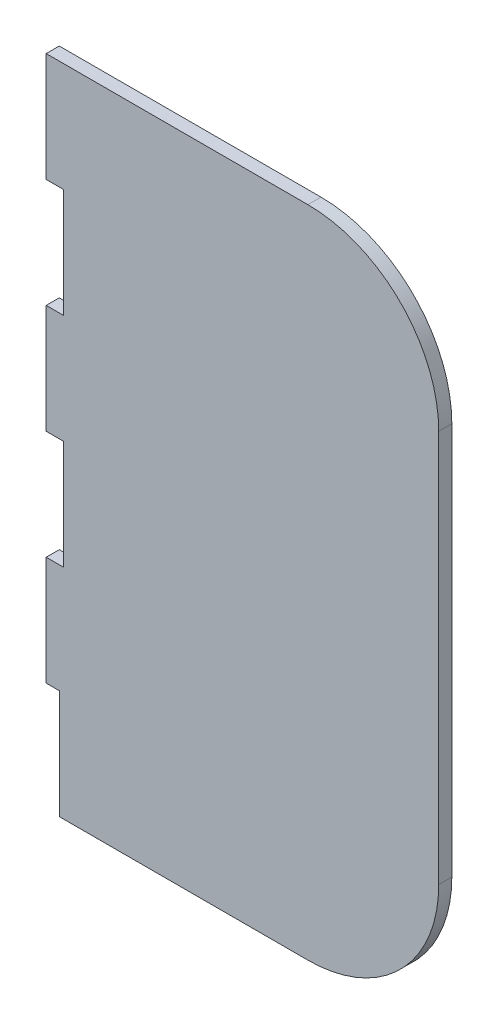
ISO-10303-21;
HEADER;
FILE_DESCRIPTION(('STEP AP214'),'2;1');
FILE_NAME('part.step','',(''),(''),'','','');
FILE_SCHEMA(('AUTOMOTIVE_DESIGN { 1 0 10303 214 1 1 1 1 }'));
ENDSEC;
DATA;
#1=APPLICATION_CONTEXT('core data for automotive mechanical design processes');
#2=APPLICATION_PROTOCOL_DEFINITION('international standard','automotive_design',2000,#1);
#3=PRODUCT_CONTEXT('',#1,'mechanical');
#4=PRODUCT('Part','Part','',(#3));
#5=PRODUCT_RELATED_PRODUCT_CATEGORY('part','',(#4));
#6=PRODUCT_DEFINITION_FORMATION('','',#4);
#7=PRODUCT_DEFINITION_CONTEXT('part definition',#1,'design');
#8=PRODUCT_DEFINITION('design','',#6,#7);
#9=PRODUCT_DEFINITION_SHAPE('','',#8);
#10=(LENGTH_UNIT() NAMED_UNIT(*) SI_UNIT(.MILLI.,.METRE.));
#11=(NAMED_UNIT(*) PLANE_ANGLE_UNIT() SI_UNIT($,.RADIAN.));
#12=(NAMED_UNIT(*) SI_UNIT($,.STERADIAN.) SOLID_ANGLE_UNIT());
#13=UNCERTAINTY_MEASURE_WITH_UNIT(LENGTH_MEASURE(1.E-05),#10,'distance_accuracy_value','');
#14=(GEOMETRIC_REPRESENTATION_CONTEXT(3) GLOBAL_UNCERTAINTY_ASSIGNED_CONTEXT((#13)) GLOBAL_UNIT_ASSIGNED_CONTEXT((#10,
#11,#12)) REPRESENTATION_CONTEXT('',''));
#15=CARTESIAN_POINT('',(0.,0.,0.));
#16=DIRECTION('',(0.,0.,1.));
#17=DIRECTION('',(1.,0.,0.));
#18=AXIS2_PLACEMENT_3D('',#15,#16,#17);
#19=CARTESIAN_POINT('',(0.,0.,3.));
#20=DIRECTION('',(-1.,0.,0.));
#21=DIRECTION('',(0.,-1.,0.));
#22=AXIS2_PLACEMENT_3D('',#19,#20,#21);
#23=PLANE('',#22);
#24=DIRECTION('',(0.,0.,1.));
#25=VECTOR('',#24,1.);
#26=CARTESIAN_POINT('',(0.,125.,0.));
#27=LINE('',#26,#25);
#28=CARTESIAN_POINT('',(0.,125.,0.));
#29=VERTEX_POINT('',#28);
#30=CARTESIAN_POINT('',(0.,125.,3.));
#31=VERTEX_POINT('',#30);
#32=EDGE_CURVE('E194',#29,#31,#27,.T.);
#33=ORIENTED_EDGE('',*,*,#32,.T.);
#34=DIRECTION('',(0.,1.,0.));
#35=VECTOR('',#34,1.);
#36=CARTESIAN_POINT('',(0.,0.,3.));
#37=LINE('',#36,#35);
#38=CARTESIAN_POINT('',(0.,150.,3.));
#39=VERTEX_POINT('',#38);
#40=EDGE_CURVE('E206',#31,#39,#37,.T.);
#41=ORIENTED_EDGE('',*,*,#40,.T.);
#42=DIRECTION('',(0.,0.,-1.));
#43=VECTOR('',#42,1.);
#44=CARTESIAN_POINT('',(0.,150.,3.));
#45=LINE('',#44,#43);
#46=CARTESIAN_POINT('',(0.,150.,0.));
#47=VERTEX_POINT('',#46);
#48=EDGE_CURVE('E207',#39,#47,#45,.T.);
#49=ORIENTED_EDGE('',*,*,#48,.T.);
#50=DIRECTION('',(0.,1.,0.));
#51=VECTOR('',#50,1.);
#52=CARTESIAN_POINT('',(0.,0.,0.));
#53=LINE('',#52,#51);
#54=EDGE_CURVE('E190',#29,#47,#53,.T.);
#55=ORIENTED_EDGE('',*,*,#54,.F.);
#56=EDGE_LOOP('',(#33,#41,#49,#55));
#57=FACE_BOUND('',#56,.T.);
#58=ADVANCED_FACE('F43',(#57),#23,.T.);
#59=DIRECTION('',(0.,0.,1.));
#60=VECTOR('',#59,1.);
#61=CARTESIAN_POINT('',(0.,100.,0.));
#62=LINE('',#61,#60);
#63=CARTESIAN_POINT('',(0.,100.,0.));
#64=VERTEX_POINT('',#63);
#65=CARTESIAN_POINT('',(0.,100.,3.));
#66=VERTEX_POINT('',#65);
#67=EDGE_CURVE('E164',#64,#66,#62,.T.);
#68=ORIENTED_EDGE('',*,*,#67,.F.);
#69=CARTESIAN_POINT('',(0.,75.,0.));
#70=VERTEX_POINT('',#69);
#71=EDGE_CURVE('E178',#70,#64,#53,.T.);
#72=ORIENTED_EDGE('',*,*,#71,.F.);
#73=DIRECTION('',(0.,0.,1.));
#74=VECTOR('',#73,1.);
#75=CARTESIAN_POINT('',(0.,75.,0.));
#76=LINE('',#75,#74);
#77=CARTESIAN_POINT('',(0.,75.,3.));
#78=VERTEX_POINT('',#77);
#79=EDGE_CURVE('E256',#70,#78,#76,.T.);
#80=ORIENTED_EDGE('',*,*,#79,.T.);
#81=EDGE_CURVE('E180',#78,#66,#37,.T.);
#82=ORIENTED_EDGE('',*,*,#81,.T.);
#83=EDGE_LOOP('',(#68,#72,#80,#82));
#84=FACE_BOUND('',#83,.T.);
#85=ADVANCED_FACE('F176',(#84),#23,.T.);
#86=DIRECTION('',(0.,0.,1.));
#87=VECTOR('',#86,1.);
#88=CARTESIAN_POINT('',(0.,50.,0.));
#89=LINE('',#88,#87);
#90=CARTESIAN_POINT('',(0.,50.,0.));
#91=VERTEX_POINT('',#90);
#92=CARTESIAN_POINT('',(0.,50.,3.));
#93=VERTEX_POINT('',#92);
#94=EDGE_CURVE('E270',#91,#93,#89,.T.);
#95=ORIENTED_EDGE('',*,*,#94,.F.);
#96=CARTESIAN_POINT('',(0.,25.,0.));
#97=VERTEX_POINT('',#96);
#98=EDGE_CURVE('E189',#97,#91,#53,.T.);
#99=ORIENTED_EDGE('',*,*,#98,.F.);
#100=DIRECTION('',(0.,0.,1.));
#101=VECTOR('',#100,1.);
#102=CARTESIAN_POINT('',(0.,25.,0.));
#103=LINE('',#102,#101);
#104=CARTESIAN_POINT('',(0.,25.,3.));
#105=VERTEX_POINT('',#104);
#106=EDGE_CURVE('E245',#97,#105,#103,.T.);
#107=ORIENTED_EDGE('',*,*,#106,.T.);
#108=EDGE_CURVE('E260',#105,#93,#37,.T.);
#109=ORIENTED_EDGE('',*,*,#108,.T.);
#110=EDGE_LOOP('',(#95,#99,#107,#109));
#111=FACE_BOUND('',#110,.T.);
#112=ADVANCED_FACE('F268',(#111),#23,.T.);
#113=CARTESIAN_POINT('',(0.,0.,3.));
#114=DIRECTION('',(0.,1.,0.));
#115=DIRECTION('',(0.,0.,1.));
#116=AXIS2_PLACEMENT_3D('',#113,#114,#115);
#117=PLANE('',#116);
#118=DIRECTION('',(1.,0.,0.));
#119=VECTOR('',#118,1.);
#120=CARTESIAN_POINT('',(0.,0.,0.));
#121=LINE('',#120,#119);
#122=CARTESIAN_POINT('',(3.,0.,0.));
#123=VERTEX_POINT('',#122);
#124=CARTESIAN_POINT('',(60.,0.,0.));
#125=VERTEX_POINT('',#124);
#126=EDGE_CURVE('E204',#123,#125,#121,.T.);
#127=ORIENTED_EDGE('',*,*,#126,.T.);
#128=DIRECTION('',(0.,0.,-1.));
#129=VECTOR('',#128,1.);
#130=CARTESIAN_POINT('',(60.,0.,3.));
#131=LINE('',#130,#129);
#132=CARTESIAN_POINT('',(60.,0.,3.));
#133=VERTEX_POINT('',#132);
#134=EDGE_CURVE('E66',#125,#133,#131,.F.);
#135=ORIENTED_EDGE('',*,*,#134,.T.);
#136=DIRECTION('',(1.,0.,0.));
#137=VECTOR('',#136,1.);
#138=CARTESIAN_POINT('',(0.,0.,3.));
#139=LINE('',#138,#137);
#140=CARTESIAN_POINT('',(3.,0.,3.));
#141=VERTEX_POINT('',#140);
#142=EDGE_CURVE('E197',#141,#133,#139,.T.);
#143=ORIENTED_EDGE('',*,*,#142,.F.);
#144=DIRECTION('',(0.,0.,1.));
#145=VECTOR('',#144,1.);
#146=CARTESIAN_POINT('',(3.,0.,0.));
#147=LINE('',#146,#145);
#148=EDGE_CURVE('E236',#123,#141,#147,.T.);
#149=ORIENTED_EDGE('',*,*,#148,.F.);
#150=EDGE_LOOP('',(#127,#135,#143,#149));
#151=FACE_BOUND('',#150,.T.);
#152=ADVANCED_FACE('F235',(#151),#117,.F.);
#153=CARTESIAN_POINT('',(90.,0.,3.));
#154=DIRECTION('',(-1.,0.,0.));
#155=DIRECTION('',(0.,-1.,0.));
#156=AXIS2_PLACEMENT_3D('',#153,#154,#155);
#157=PLANE('',#156);
#158=DIRECTION('',(0.,1.,0.));
#159=VECTOR('',#158,1.);
#160=CARTESIAN_POINT('',(90.,0.,3.));
#161=LINE('',#160,#159);
#162=CARTESIAN_POINT('',(90.,30.,3.));
#163=VERTEX_POINT('',#162);
#164=CARTESIAN_POINT('',(90.,120.,3.));
#165=VERTEX_POINT('',#164);
#166=EDGE_CURVE('E223',#163,#165,#161,.T.);
#167=ORIENTED_EDGE('',*,*,#166,.F.);
#168=DIRECTION('',(0.,0.,-1.));
#169=VECTOR('',#168,1.);
#170=CARTESIAN_POINT('',(90.,30.,3.));
#171=LINE('',#170,#169);
#172=CARTESIAN_POINT('',(90.,30.,0.));
#173=VERTEX_POINT('',#172);
#174=EDGE_CURVE('E212',#163,#173,#171,.T.);
#175=ORIENTED_EDGE('',*,*,#174,.T.);
#176=DIRECTION('',(0.,1.,0.));
#177=VECTOR('',#176,1.);
#178=CARTESIAN_POINT('',(90.,0.,0.));
#179=LINE('',#178,#177);
#180=CARTESIAN_POINT('',(90.,120.,0.));
#181=VERTEX_POINT('',#180);
#182=EDGE_CURVE('E201',#173,#181,#179,.T.);
#183=ORIENTED_EDGE('',*,*,#182,.T.);
#184=DIRECTION('',(0.,0.,-1.));
#185=VECTOR('',#184,1.);
#186=CARTESIAN_POINT('',(90.,120.,3.));
#187=LINE('',#186,#185);
#188=EDGE_CURVE('E210',#181,#165,#187,.F.);
#189=ORIENTED_EDGE('',*,*,#188,.T.);
#190=EDGE_LOOP('',(#167,#175,#183,#189));
#191=FACE_BOUND('',#190,.T.);
#192=ADVANCED_FACE('F228',(#191),#157,.F.);
#193=CARTESIAN_POINT('',(0.,150.,3.));
#194=DIRECTION('',(0.,1.,0.));
#195=DIRECTION('',(0.,0.,1.));
#196=AXIS2_PLACEMENT_3D('',#193,#194,#195);
#197=PLANE('',#196);
#198=DIRECTION('',(1.,0.,0.));
#199=VECTOR('',#198,1.);
#200=CARTESIAN_POINT('',(0.,150.,3.));
#201=LINE('',#200,#199);
#202=CARTESIAN_POINT('',(59.9999999999999,150.,3.));
#203=VERTEX_POINT('',#202);
#204=EDGE_CURVE('E230',#39,#203,#201,.T.);
#205=ORIENTED_EDGE('',*,*,#204,.T.);
#206=DIRECTION('',(0.,0.,-1.));
#207=VECTOR('',#206,1.);
#208=CARTESIAN_POINT('',(60.,150.,0.));
#209=LINE('',#208,#207);
#210=CARTESIAN_POINT('',(59.9999999999999,150.,0.));
#211=VERTEX_POINT('',#210);
#212=EDGE_CURVE('E11',#203,#211,#209,.T.);
#213=ORIENTED_EDGE('',*,*,#212,.T.);
#214=DIRECTION('',(1.,0.,0.));
#215=VECTOR('',#214,1.);
#216=CARTESIAN_POINT('',(0.,150.,0.));
#217=LINE('',#216,#215);
#218=EDGE_CURVE('E193',#47,#211,#217,.T.);
#219=ORIENTED_EDGE('',*,*,#218,.F.);
#220=ORIENTED_EDGE('',*,*,#48,.F.);
#221=EDGE_LOOP('',(#205,#213,#219,#220));
#222=FACE_BOUND('',#221,.T.);
#223=ADVANCED_FACE('F320',(#222),#197,.T.);
#224=CARTESIAN_POINT('',(0.,0.,3.));
#225=DIRECTION('',(0.,0.,-1.));
#226=DIRECTION('',(-1.,0.,0.));
#227=AXIS2_PLACEMENT_3D('',#224,#225,#226);
#228=PLANE('',#227);
#229=ORIENTED_EDGE('',*,*,#142,.T.);
#230=CARTESIAN_POINT('',(60.,30.,3.));
#231=DIRECTION('',(0.,0.,-1.));
#232=DIRECTION('',(-1.,0.,0.));
#233=AXIS2_PLACEMENT_3D('',#230,#231,#232);
#234=CIRCLE('',#233,30.);
#235=EDGE_CURVE('E51',#133,#163,#234,.F.);
#236=ORIENTED_EDGE('',*,*,#235,.T.);
#237=ORIENTED_EDGE('',*,*,#166,.T.);
#238=CARTESIAN_POINT('',(60.,120.,3.));
#239=DIRECTION('',(0.,0.,-1.));
#240=DIRECTION('',(-1.,0.,0.));
#241=AXIS2_PLACEMENT_3D('',#238,#239,#240);
#242=CIRCLE('',#241,30.);
#243=EDGE_CURVE('E58',#165,#203,#242,.F.);
#244=ORIENTED_EDGE('',*,*,#243,.T.);
#245=ORIENTED_EDGE('',*,*,#204,.F.);
#246=ORIENTED_EDGE('',*,*,#40,.F.);
#247=DIRECTION('',(-1.,0.,0.));
#248=VECTOR('',#247,1.);
#249=CARTESIAN_POINT('',(0.,125.,3.));
#250=LINE('',#249,#248);
#251=CARTESIAN_POINT('',(3.93519762586794,125.,3.));
#252=VERTEX_POINT('',#251);
#253=EDGE_CURVE('E171',#252,#31,#250,.T.);
#254=ORIENTED_EDGE('',*,*,#253,.F.);
#255=DIRECTION('',(0.,1.,0.));
#256=VECTOR('',#255,1.);
#257=CARTESIAN_POINT('',(3.93519762586794,125.,3.));
#258=LINE('',#257,#256);
#259=CARTESIAN_POINT('',(3.935197625868,100.,3.));
#260=VERTEX_POINT('',#259);
#261=EDGE_CURVE('E283',#260,#252,#258,.T.);
#262=ORIENTED_EDGE('',*,*,#261,.F.);
#263=DIRECTION('',(1.,0.,0.));
#264=VECTOR('',#263,1.);
#265=CARTESIAN_POINT('',(0.,100.,3.));
#266=LINE('',#265,#264);
#267=EDGE_CURVE('E281',#66,#260,#266,.T.);
#268=ORIENTED_EDGE('',*,*,#267,.F.);
#269=ORIENTED_EDGE('',*,*,#81,.F.);
#270=DIRECTION('',(-1.,0.,0.));
#271=VECTOR('',#270,1.);
#272=CARTESIAN_POINT('',(0.,75.,3.));
#273=LINE('',#272,#271);
#274=CARTESIAN_POINT('',(3.93519762586794,75.,3.));
#275=VERTEX_POINT('',#274);
#276=EDGE_CURVE('E285',#275,#78,#273,.T.);
#277=ORIENTED_EDGE('',*,*,#276,.F.);
#278=DIRECTION('',(0.,1.,0.));
#279=VECTOR('',#278,1.);
#280=CARTESIAN_POINT('',(3.93519762586794,75.,3.));
#281=LINE('',#280,#279);
#282=CARTESIAN_POINT('',(3.93519762586798,50.,3.));
#283=VERTEX_POINT('',#282);
#284=EDGE_CURVE('E278',#283,#275,#281,.T.);
#285=ORIENTED_EDGE('',*,*,#284,.F.);
#286=DIRECTION('',(1.,0.,0.));
#287=VECTOR('',#286,1.);
#288=CARTESIAN_POINT('',(0.,50.,3.));
#289=LINE('',#288,#287);
#290=EDGE_CURVE('E275',#93,#283,#289,.T.);
#291=ORIENTED_EDGE('',*,*,#290,.F.);
#292=ORIENTED_EDGE('',*,*,#108,.F.);
#293=DIRECTION('',(-1.,0.,0.));
#294=VECTOR('',#293,1.);
#295=CARTESIAN_POINT('',(0.,25.,3.));
#296=LINE('',#295,#294);
#297=CARTESIAN_POINT('',(3.,25.,3.));
#298=VERTEX_POINT('',#297);
#299=EDGE_CURVE('E253',#298,#105,#296,.T.);
#300=ORIENTED_EDGE('',*,*,#299,.F.);
#301=DIRECTION('',(0.,1.,0.));
#302=VECTOR('',#301,1.);
#303=CARTESIAN_POINT('',(3.,0.,3.));
#304=LINE('',#303,#302);
#305=EDGE_CURVE('E255',#141,#298,#304,.T.);
#306=ORIENTED_EDGE('',*,*,#305,.F.);
#307=EDGE_LOOP('',(#229,#236,#237,#244,#245,#246,#254,#262,#268,#269,#277,#285,#291,#292,#300,#306));
#308=FACE_BOUND('',#307,.T.);
#309=ADVANCED_FACE('F222',(#308),#228,.F.);
#310=CARTESIAN_POINT('',(0.,0.,0.));
#311=DIRECTION('',(0.,0.,-1.));
#312=DIRECTION('',(-1.,0.,0.));
#313=AXIS2_PLACEMENT_3D('',#310,#311,#312);
#314=PLANE('',#313);
#315=ORIENTED_EDGE('',*,*,#182,.F.);
#316=CARTESIAN_POINT('',(60.,30.,0.));
#317=DIRECTION('',(0.,0.,-1.));
#318=DIRECTION('',(-1.,0.,0.));
#319=AXIS2_PLACEMENT_3D('',#316,#317,#318);
#320=CIRCLE('',#319,30.);
#321=EDGE_CURVE('E217',#173,#125,#320,.T.);
#322=ORIENTED_EDGE('',*,*,#321,.T.);
#323=ORIENTED_EDGE('',*,*,#126,.F.);
#324=DIRECTION('',(0.,1.,0.));
#325=VECTOR('',#324,1.);
#326=CARTESIAN_POINT('',(3.,0.,0.));
#327=LINE('',#326,#325);
#328=CARTESIAN_POINT('',(3.,25.,0.));
#329=VERTEX_POINT('',#328);
#330=EDGE_CURVE('E243',#123,#329,#327,.T.);
#331=ORIENTED_EDGE('',*,*,#330,.T.);
#332=DIRECTION('',(-1.,0.,0.));
#333=VECTOR('',#332,1.);
#334=CARTESIAN_POINT('',(0.,25.,0.));
#335=LINE('',#334,#333);
#336=EDGE_CURVE('E239',#329,#97,#335,.T.);
#337=ORIENTED_EDGE('',*,*,#336,.T.);
#338=ORIENTED_EDGE('',*,*,#98,.T.);
#339=DIRECTION('',(1.,0.,0.));
#340=VECTOR('',#339,1.);
#341=CARTESIAN_POINT('',(0.,50.,0.));
#342=LINE('',#341,#340);
#343=CARTESIAN_POINT('',(3.93519762586798,50.,0.));
#344=VERTEX_POINT('',#343);
#345=EDGE_CURVE('E248',#91,#344,#342,.T.);
#346=ORIENTED_EDGE('',*,*,#345,.T.);
#347=DIRECTION('',(0.,1.,0.));
#348=VECTOR('',#347,1.);
#349=CARTESIAN_POINT('',(3.93519762586794,75.,0.));
#350=LINE('',#349,#348);
#351=CARTESIAN_POINT('',(3.93519762586794,75.,0.));
#352=VERTEX_POINT('',#351);
#353=EDGE_CURVE('E289',#344,#352,#350,.T.);
#354=ORIENTED_EDGE('',*,*,#353,.T.);
#355=DIRECTION('',(-1.,0.,0.));
#356=VECTOR('',#355,1.);
#357=CARTESIAN_POINT('',(0.,75.,0.));
#358=LINE('',#357,#356);
#359=EDGE_CURVE('E188',#352,#70,#358,.T.);
#360=ORIENTED_EDGE('',*,*,#359,.T.);
#361=ORIENTED_EDGE('',*,*,#71,.T.);
#362=DIRECTION('',(1.,0.,0.));
#363=VECTOR('',#362,1.);
#364=CARTESIAN_POINT('',(0.,100.,0.));
#365=LINE('',#364,#363);
#366=CARTESIAN_POINT('',(3.935197625868,100.,0.));
#367=VERTEX_POINT('',#366);
#368=EDGE_CURVE('E160',#64,#367,#365,.T.);
#369=ORIENTED_EDGE('',*,*,#368,.T.);
#370=DIRECTION('',(0.,1.,0.));
#371=VECTOR('',#370,1.);
#372=CARTESIAN_POINT('',(3.93519762586794,125.,0.));
#373=LINE('',#372,#371);
#374=CARTESIAN_POINT('',(3.93519762586794,125.,0.));
#375=VERTEX_POINT('',#374);
#376=EDGE_CURVE('E170',#367,#375,#373,.T.);
#377=ORIENTED_EDGE('',*,*,#376,.T.);
#378=DIRECTION('',(-1.,0.,0.));
#379=VECTOR('',#378,1.);
#380=CARTESIAN_POINT('',(0.,125.,0.));
#381=LINE('',#380,#379);
#382=EDGE_CURVE('E181',#375,#29,#381,.T.);
#383=ORIENTED_EDGE('',*,*,#382,.T.);
#384=ORIENTED_EDGE('',*,*,#54,.T.);
#385=ORIENTED_EDGE('',*,*,#218,.T.);
#386=CARTESIAN_POINT('',(60.,120.,0.));
#387=DIRECTION('',(0.,0.,-1.));
#388=DIRECTION('',(-1.,0.,0.));
#389=AXIS2_PLACEMENT_3D('',#386,#387,#388);
#390=CIRCLE('',#389,30.);
#391=EDGE_CURVE('E215',#211,#181,#390,.T.);
#392=ORIENTED_EDGE('',*,*,#391,.T.);
#393=EDGE_LOOP('',(#315,#322,#323,#331,#337,#338,#346,#354,#360,#361,#369,#377,#383,#384,#385,#392));
#394=FACE_BOUND('',#393,.T.);
#395=ADVANCED_FACE('F185',(#394),#314,.T.);
#396=CARTESIAN_POINT('',(0.,25.,0.));
#397=DIRECTION('',(0.,1.,0.));
#398=DIRECTION('',(0.,0.,1.));
#399=AXIS2_PLACEMENT_3D('',#396,#397,#398);
#400=PLANE('',#399);
#401=ORIENTED_EDGE('',*,*,#299,.T.);
#402=ORIENTED_EDGE('',*,*,#106,.F.);
#403=ORIENTED_EDGE('',*,*,#336,.F.);
#404=DIRECTION('',(0.,0.,1.));
#405=VECTOR('',#404,1.);
#406=CARTESIAN_POINT('',(3.,25.,0.));
#407=LINE('',#406,#405);
#408=EDGE_CURVE('E240',#329,#298,#407,.T.);
#409=ORIENTED_EDGE('',*,*,#408,.T.);
#410=EDGE_LOOP('',(#401,#402,#403,#409));
#411=FACE_BOUND('',#410,.T.);
#412=ADVANCED_FACE('F352',(#411),#400,.F.);
#413=CARTESIAN_POINT('',(3.,0.,0.));
#414=DIRECTION('',(1.,0.,0.));
#415=DIRECTION('',(0.,0.,-1.));
#416=AXIS2_PLACEMENT_3D('',#413,#414,#415);
#417=PLANE('',#416);
#418=ORIENTED_EDGE('',*,*,#305,.T.);
#419=ORIENTED_EDGE('',*,*,#408,.F.);
#420=ORIENTED_EDGE('',*,*,#330,.F.);
#421=ORIENTED_EDGE('',*,*,#148,.T.);
#422=EDGE_LOOP('',(#418,#419,#420,#421));
#423=FACE_BOUND('',#422,.T.);
#424=ADVANCED_FACE('F355',(#423),#417,.F.);
#425=CARTESIAN_POINT('',(0.,75.,0.));
#426=DIRECTION('',(0.,1.,0.));
#427=DIRECTION('',(0.,0.,1.));
#428=AXIS2_PLACEMENT_3D('',#425,#426,#427);
#429=PLANE('',#428);
#430=ORIENTED_EDGE('',*,*,#276,.T.);
#431=ORIENTED_EDGE('',*,*,#79,.F.);
#432=ORIENTED_EDGE('',*,*,#359,.F.);
#433=DIRECTION('',(0.,0.,1.));
#434=VECTOR('',#433,1.);
#435=CARTESIAN_POINT('',(3.93519762586794,75.,0.));
#436=LINE('',#435,#434);
#437=EDGE_CURVE('E294',#352,#275,#436,.T.);
#438=ORIENTED_EDGE('',*,*,#437,.T.);
#439=EDGE_LOOP('',(#430,#431,#432,#438));
#440=FACE_BOUND('',#439,.T.);
#441=ADVANCED_FACE('F359',(#440),#429,.F.);
#442=CARTESIAN_POINT('',(3.93519762586794,75.,0.));
#443=DIRECTION('',(1.,0.,0.));
#444=DIRECTION('',(0.,1.,0.));
#445=AXIS2_PLACEMENT_3D('',#442,#443,#444);
#446=PLANE('',#445);
#447=ORIENTED_EDGE('',*,*,#284,.T.);
#448=ORIENTED_EDGE('',*,*,#437,.F.);
#449=ORIENTED_EDGE('',*,*,#353,.F.);
#450=DIRECTION('',(0.,0.,1.));
#451=VECTOR('',#450,1.);
#452=CARTESIAN_POINT('',(3.93519762586798,50.,0.));
#453=LINE('',#452,#451);
#454=EDGE_CURVE('E296',#344,#283,#453,.T.);
#455=ORIENTED_EDGE('',*,*,#454,.T.);
#456=EDGE_LOOP('',(#447,#448,#449,#455));
#457=FACE_BOUND('',#456,.T.);
#458=ADVANCED_FACE('F362',(#457),#446,.F.);
#459=CARTESIAN_POINT('',(0.,50.,0.));
#460=DIRECTION('',(0.,-1.,0.));
#461=DIRECTION('',(0.,0.,-1.));
#462=AXIS2_PLACEMENT_3D('',#459,#460,#461);
#463=PLANE('',#462);
#464=ORIENTED_EDGE('',*,*,#290,.T.);
#465=ORIENTED_EDGE('',*,*,#454,.F.);
#466=ORIENTED_EDGE('',*,*,#345,.F.);
#467=ORIENTED_EDGE('',*,*,#94,.T.);
#468=EDGE_LOOP('',(#464,#465,#466,#467));
#469=FACE_BOUND('',#468,.T.);
#470=ADVANCED_FACE('F365',(#469),#463,.F.);
#471=CARTESIAN_POINT('',(0.,125.,0.));
#472=DIRECTION('',(0.,1.,0.));
#473=DIRECTION('',(0.,0.,1.));
#474=AXIS2_PLACEMENT_3D('',#471,#472,#473);
#475=PLANE('',#474);
#476=ORIENTED_EDGE('',*,*,#253,.T.);
#477=ORIENTED_EDGE('',*,*,#32,.F.);
#478=ORIENTED_EDGE('',*,*,#382,.F.);
#479=DIRECTION('',(0.,0.,1.));
#480=VECTOR('',#479,1.);
#481=CARTESIAN_POINT('',(3.93519762586794,125.,0.));
#482=LINE('',#481,#480);
#483=EDGE_CURVE('E300',#375,#252,#482,.T.);
#484=ORIENTED_EDGE('',*,*,#483,.T.);
#485=EDGE_LOOP('',(#476,#477,#478,#484));
#486=FACE_BOUND('',#485,.T.);
#487=ADVANCED_FACE('F316',(#486),#475,.F.);
#488=CARTESIAN_POINT('',(3.93519762586794,125.,0.));
#489=DIRECTION('',(1.,0.,0.));
#490=DIRECTION('',(0.,1.,0.));
#491=AXIS2_PLACEMENT_3D('',#488,#489,#490);
#492=PLANE('',#491);
#493=ORIENTED_EDGE('',*,*,#261,.T.);
#494=ORIENTED_EDGE('',*,*,#483,.F.);
#495=ORIENTED_EDGE('',*,*,#376,.F.);
#496=DIRECTION('',(0.,0.,1.));
#497=VECTOR('',#496,1.);
#498=CARTESIAN_POINT('',(3.935197625868,100.,0.));
#499=LINE('',#498,#497);
#500=EDGE_CURVE('E166',#367,#260,#499,.T.);
#501=ORIENTED_EDGE('',*,*,#500,.T.);
#502=EDGE_LOOP('',(#493,#494,#495,#501));
#503=FACE_BOUND('',#502,.T.);
#504=ADVANCED_FACE('F312',(#503),#492,.F.);
#505=CARTESIAN_POINT('',(0.,100.,0.));
#506=DIRECTION('',(0.,-1.,0.));
#507=DIRECTION('',(0.,0.,-1.));
#508=AXIS2_PLACEMENT_3D('',#505,#506,#507);
#509=PLANE('',#508);
#510=ORIENTED_EDGE('',*,*,#267,.T.);
#511=ORIENTED_EDGE('',*,*,#500,.F.);
#512=ORIENTED_EDGE('',*,*,#368,.F.);
#513=ORIENTED_EDGE('',*,*,#67,.T.);
#514=EDGE_LOOP('',(#510,#511,#512,#513));
#515=FACE_BOUND('',#514,.T.);
#516=ADVANCED_FACE('F163',(#515),#509,.F.);
#517=CARTESIAN_POINT('',(60.,30.,3.));
#518=DIRECTION('',(0.,0.,-1.));
#519=DIRECTION('',(-1.,0.,0.));
#520=AXIS2_PLACEMENT_3D('',#517,#518,#519);
#521=CYLINDRICAL_SURFACE('',#520,30.);
#522=ORIENTED_EDGE('',*,*,#235,.F.);
#523=ORIENTED_EDGE('',*,*,#134,.F.);
#524=ORIENTED_EDGE('',*,*,#321,.F.);
#525=ORIENTED_EDGE('',*,*,#174,.F.);
#526=EDGE_LOOP('',(#522,#523,#524,#525));
#527=FACE_BOUND('',#526,.T.);
#528=ADVANCED_FACE('F231',(#527),#521,.T.);
#529=CARTESIAN_POINT('',(60.,120.,3.));
#530=DIRECTION('',(0.,0.,1.));
#531=DIRECTION('',(1.,0.,0.));
#532=AXIS2_PLACEMENT_3D('',#529,#530,#531);
#533=CYLINDRICAL_SURFACE('',#532,30.);
#534=ORIENTED_EDGE('',*,*,#243,.F.);
#535=ORIENTED_EDGE('',*,*,#188,.F.);
#536=ORIENTED_EDGE('',*,*,#391,.F.);
#537=ORIENTED_EDGE('',*,*,#212,.F.);
#538=EDGE_LOOP('',(#534,#535,#536,#537));
#539=FACE_BOUND('',#538,.T.);
#540=ADVANCED_FACE('F45',(#539),#533,.T.);
#541=CLOSED_SHELL('',(#58,#85,#112,#152,#192,#223,#309,#395,#412,#424,#441,#458,#470,#487,#504,
#516,#528,#540));
#542=MANIFOLD_SOLID_BREP('B2',#541);
#543=ADVANCED_BREP_SHAPE_REPRESENTATION('',(#18,#542),#14);
#544=SHAPE_DEFINITION_REPRESENTATION(#9,#543);
ENDSEC;
END-ISO-10303-21;
